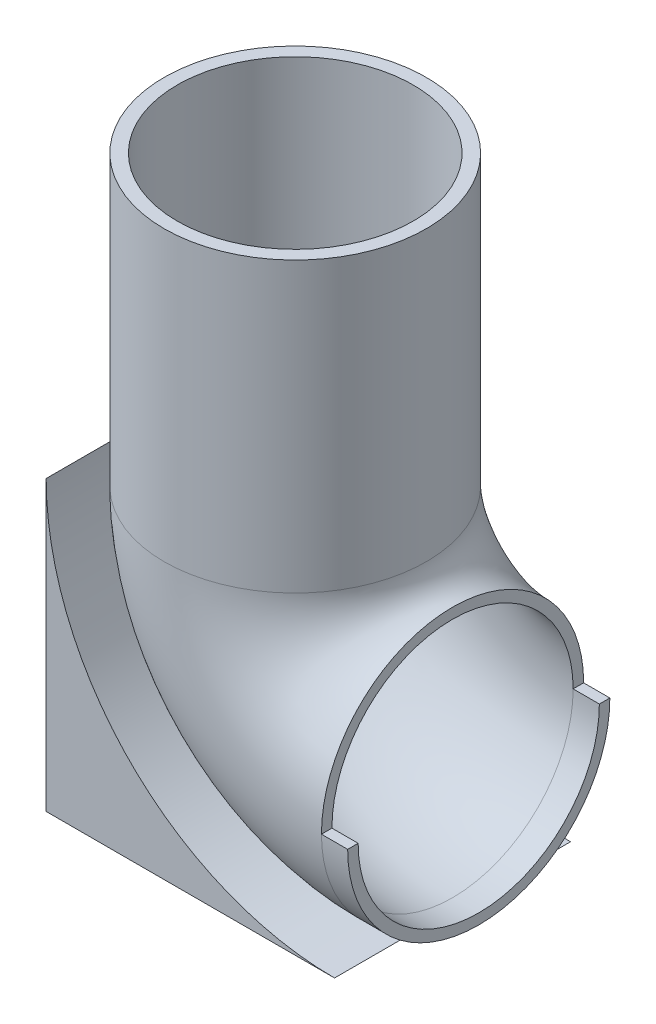
ISO-10303-21;
HEADER;
FILE_DESCRIPTION(('STEP AP214'),'2;1');
FILE_NAME('part.step','',(''),(''),'','','');
FILE_SCHEMA(('AUTOMOTIVE_DESIGN { 1 0 10303 214 1 1 1 1 }'));
ENDSEC;
DATA;
#1=APPLICATION_CONTEXT('core data for automotive mechanical design processes');
#2=APPLICATION_PROTOCOL_DEFINITION('international standard','automotive_design',2000,#1);
#3=PRODUCT_CONTEXT('',#1,'mechanical');
#4=PRODUCT('Part','Part','',(#3));
#5=PRODUCT_RELATED_PRODUCT_CATEGORY('part','',(#4));
#6=PRODUCT_DEFINITION_FORMATION('','',#4);
#7=PRODUCT_DEFINITION_CONTEXT('part definition',#1,'design');
#8=PRODUCT_DEFINITION('design','',#6,#7);
#9=PRODUCT_DEFINITION_SHAPE('','',#8);
#10=(LENGTH_UNIT() NAMED_UNIT(*) SI_UNIT(.MILLI.,.METRE.));
#11=(NAMED_UNIT(*) PLANE_ANGLE_UNIT() SI_UNIT($,.RADIAN.));
#12=(NAMED_UNIT(*) SI_UNIT($,.STERADIAN.) SOLID_ANGLE_UNIT());
#13=UNCERTAINTY_MEASURE_WITH_UNIT(LENGTH_MEASURE(1.E-05),#10,'distance_accuracy_value','');
#14=(GEOMETRIC_REPRESENTATION_CONTEXT(3) GLOBAL_UNCERTAINTY_ASSIGNED_CONTEXT((#13)) GLOBAL_UNIT_ASSIGNED_CONTEXT((#10,
#11,#12)) REPRESENTATION_CONTEXT('',''));
#15=CARTESIAN_POINT('',(0.,0.,0.));
#16=DIRECTION('',(0.,0.,1.));
#17=DIRECTION('',(1.,0.,0.));
#18=AXIS2_PLACEMENT_3D('',#15,#16,#17);
#19=CARTESIAN_POINT('',(0.,0.,22.5));
#20=DIRECTION('',(0.,0.,-1.));
#21=DIRECTION('',(-1.,0.,0.));
#22=AXIS2_PLACEMENT_3D('',#19,#20,#21);
#23=PLANE('',#22);
#24=CARTESIAN_POINT('',(30.0000000000001,0.,22.5));
#25=DIRECTION('',(0.,0.,-1.));
#26=DIRECTION('',(-1.,0.,0.));
#27=AXIS2_PLACEMENT_3D('',#24,#25,#26);
#28=CIRCLE('',#27,55.0000000000001);
#29=CARTESIAN_POINT('',(30.0000000000002,-55.,22.5));
#30=VERTEX_POINT('',#29);
#31=CARTESIAN_POINT('',(-25.,0.,22.5));
#32=VERTEX_POINT('',#31);
#33=EDGE_CURVE('E111',#30,#32,#28,.T.);
#34=ORIENTED_EDGE('',*,*,#33,.T.);
#35=DIRECTION('',(0.,-1.,0.));
#36=VECTOR('',#35,1.);
#37=CARTESIAN_POINT('',(-25.,0.,22.5));
#38=LINE('',#37,#36);
#39=CARTESIAN_POINT('',(-25.,-55.,22.5));
#40=VERTEX_POINT('',#39);
#41=EDGE_CURVE('E116',#32,#40,#38,.T.);
#42=ORIENTED_EDGE('',*,*,#41,.T.);
#43=DIRECTION('',(-1.,0.,0.));
#44=VECTOR('',#43,1.);
#45=CARTESIAN_POINT('',(30.0000000000002,-55.,22.5));
#46=LINE('',#45,#44);
#47=EDGE_CURVE('E91',#30,#40,#46,.T.);
#48=ORIENTED_EDGE('',*,*,#47,.F.);
#49=EDGE_LOOP('',(#34,#42,#48));
#50=FACE_BOUND('',#49,.T.);
#51=ADVANCED_FACE('F82',(#50),#23,.F.);
#52=CARTESIAN_POINT('',(0.,0.,-22.5));
#53=DIRECTION('',(0.,0.,-1.));
#54=DIRECTION('',(-1.,0.,0.));
#55=AXIS2_PLACEMENT_3D('',#52,#53,#54);
#56=PLANE('',#55);
#57=CARTESIAN_POINT('',(30.0000000000001,0.,-22.5));
#58=DIRECTION('',(0.,0.,-1.));
#59=DIRECTION('',(-1.,0.,0.));
#60=AXIS2_PLACEMENT_3D('',#57,#58,#59);
#61=CIRCLE('',#60,55.0000000000001);
#62=CARTESIAN_POINT('',(30.0000000000002,-55.,-22.5));
#63=VERTEX_POINT('',#62);
#64=CARTESIAN_POINT('',(-25.,0.,-22.5));
#65=VERTEX_POINT('',#64);
#66=EDGE_CURVE('E126',#63,#65,#61,.T.);
#67=ORIENTED_EDGE('',*,*,#66,.F.);
#68=DIRECTION('',(-1.,0.,0.));
#69=VECTOR('',#68,1.);
#70=CARTESIAN_POINT('',(30.0000000000002,-55.,-22.5));
#71=LINE('',#70,#69);
#72=CARTESIAN_POINT('',(-25.,-55.,-22.5));
#73=VERTEX_POINT('',#72);
#74=EDGE_CURVE('E13',#63,#73,#71,.T.);
#75=ORIENTED_EDGE('',*,*,#74,.T.);
#76=DIRECTION('',(0.,-1.,0.));
#77=VECTOR('',#76,1.);
#78=CARTESIAN_POINT('',(-25.,0.,-22.5));
#79=LINE('',#78,#77);
#80=EDGE_CURVE('E142',#65,#73,#79,.T.);
#81=ORIENTED_EDGE('',*,*,#80,.F.);
#82=EDGE_LOOP('',(#67,#75,#81));
#83=FACE_BOUND('',#82,.T.);
#84=ADVANCED_FACE('F158',(#83),#56,.T.);
#85=CARTESIAN_POINT('',(30.0000000000001,0.,-22.5));
#86=DIRECTION('',(0.,0.,1.));
#87=DIRECTION('',(1.,0.,0.));
#88=AXIS2_PLACEMENT_3D('',#85,#86,#87);
#89=CYLINDRICAL_SURFACE('',#88,55.0000000000001);
#90=ORIENTED_EDGE('',*,*,#33,.F.);
#91=DIRECTION('',(0.,0.,1.));
#92=VECTOR('',#91,1.);
#93=CARTESIAN_POINT('',(30.0000000000002,-55.,-22.5));
#94=LINE('',#93,#92);
#95=EDGE_CURVE('E122',#63,#30,#94,.T.);
#96=ORIENTED_EDGE('',*,*,#95,.F.);
#97=ORIENTED_EDGE('',*,*,#66,.T.);
#98=DIRECTION('',(0.,0.,1.));
#99=VECTOR('',#98,1.);
#100=CARTESIAN_POINT('',(-25.,0.,-22.5));
#101=LINE('',#100,#99);
#102=EDGE_CURVE('E130',#65,#32,#101,.T.);
#103=ORIENTED_EDGE('',*,*,#102,.T.);
#104=EDGE_LOOP('',(#90,#96,#97,#103));
#105=FACE_BOUND('',#104,.T.);
#106=ADVANCED_FACE('F128',(#105),#89,.F.);
#107=CARTESIAN_POINT('',(-25.,0.,-22.5));
#108=DIRECTION('',(-1.,0.,0.));
#109=DIRECTION('',(0.,0.,1.));
#110=AXIS2_PLACEMENT_3D('',#107,#108,#109);
#111=PLANE('',#110);
#112=ORIENTED_EDGE('',*,*,#41,.F.);
#113=ORIENTED_EDGE('',*,*,#102,.F.);
#114=ORIENTED_EDGE('',*,*,#80,.T.);
#115=DIRECTION('',(0.,0.,1.));
#116=VECTOR('',#115,1.);
#117=CARTESIAN_POINT('',(-25.,-55.,-22.5));
#118=LINE('',#117,#116);
#119=EDGE_CURVE('E119',#73,#40,#118,.T.);
#120=ORIENTED_EDGE('',*,*,#119,.T.);
#121=EDGE_LOOP('',(#112,#113,#114,#120));
#122=FACE_BOUND('',#121,.T.);
#123=ADVANCED_FACE('F157',(#122),#111,.T.);
#124=CARTESIAN_POINT('',(30.0000000000002,-55.,-22.5));
#125=DIRECTION('',(0.,1.,0.));
#126=DIRECTION('',(0.,0.,1.));
#127=AXIS2_PLACEMENT_3D('',#124,#125,#126);
#128=PLANE('',#127);
#129=CARTESIAN_POINT('',(-10.,-55.,15.));
#130=DIRECTION('',(0.,-1.,0.));
#131=DIRECTION('',(0.,0.,-1.));
#132=AXIS2_PLACEMENT_3D('',#129,#130,#131);
#133=CIRCLE('',#132,4.);
#134=CARTESIAN_POINT('',(-10.,-55.,11.));
#135=VERTEX_POINT('',#134);
#136=EDGE_CURVE('E134',#135,#135,#133,.T.);
#137=ORIENTED_EDGE('',*,*,#136,.F.);
#138=EDGE_LOOP('',(#137));
#139=FACE_BOUND('',#138,.T.);
#140=CARTESIAN_POINT('',(-10.,-55.,-15.));
#141=DIRECTION('',(0.,-1.,0.));
#142=DIRECTION('',(0.,0.,-1.));
#143=AXIS2_PLACEMENT_3D('',#140,#141,#142);
#144=CIRCLE('',#143,4.);
#145=CARTESIAN_POINT('',(-10.,-55.,-19.));
#146=VERTEX_POINT('',#145);
#147=EDGE_CURVE('E195',#146,#146,#144,.T.);
#148=ORIENTED_EDGE('',*,*,#147,.F.);
#149=EDGE_LOOP('',(#148));
#150=FACE_BOUND('',#149,.T.);
#151=ORIENTED_EDGE('',*,*,#47,.T.);
#152=ORIENTED_EDGE('',*,*,#119,.F.);
#153=ORIENTED_EDGE('',*,*,#74,.F.);
#154=ORIENTED_EDGE('',*,*,#95,.T.);
#155=EDGE_LOOP('',(#151,#152,#153,#154));
#156=FACE_BOUND('',#155,.T.);
#157=ADVANCED_FACE('F123',(#139,#150,#156),#128,.F.);
#158=CARTESIAN_POINT('',(-10.,-49.,-15.));
#159=DIRECTION('',(0.,-1.,0.));
#160=DIRECTION('',(0.,0.,-1.));
#161=AXIS2_PLACEMENT_3D('',#158,#159,#160);
#162=CYLINDRICAL_SURFACE('',#161,4.);
#163=CARTESIAN_POINT('',(-10.,-49.,-15.));
#164=DIRECTION('',(0.,-1.,0.));
#165=DIRECTION('',(0.,0.,-1.));
#166=AXIS2_PLACEMENT_3D('',#163,#164,#165);
#167=CIRCLE('',#166,4.);
#168=CARTESIAN_POINT('',(-10.,-49.,-19.));
#169=VERTEX_POINT('',#168);
#170=EDGE_CURVE('E198',#169,#169,#167,.T.);
#171=ORIENTED_EDGE('',*,*,#170,.F.);
#172=EDGE_LOOP('',(#171));
#173=FACE_BOUND('',#172,.T.);
#174=ORIENTED_EDGE('',*,*,#147,.T.);
#175=EDGE_LOOP('',(#174));
#176=FACE_BOUND('',#175,.T.);
#177=ADVANCED_FACE('F165',(#173,#176),#162,.F.);
#178=CARTESIAN_POINT('',(-10.,-49.,-15.));
#179=DIRECTION('',(0.,-1.,0.));
#180=DIRECTION('',(0.,0.,-1.));
#181=AXIS2_PLACEMENT_3D('',#178,#179,#180);
#182=PLANE('',#181);
#183=ORIENTED_EDGE('',*,*,#170,.T.);
#184=EDGE_LOOP('',(#183));
#185=FACE_BOUND('',#184,.T.);
#186=ADVANCED_FACE('F173',(#185),#182,.T.);
#187=CARTESIAN_POINT('',(-10.,-49.,15.));
#188=DIRECTION('',(0.,-1.,0.));
#189=DIRECTION('',(0.,0.,-1.));
#190=AXIS2_PLACEMENT_3D('',#187,#188,#189);
#191=CYLINDRICAL_SURFACE('',#190,4.);
#192=CARTESIAN_POINT('',(-10.,-49.,15.));
#193=DIRECTION('',(0.,-1.,0.));
#194=DIRECTION('',(0.,0.,-1.));
#195=AXIS2_PLACEMENT_3D('',#192,#193,#194);
#196=CIRCLE('',#195,4.);
#197=CARTESIAN_POINT('',(-10.,-49.,11.));
#198=VERTEX_POINT('',#197);
#199=EDGE_CURVE('E131',#198,#198,#196,.T.);
#200=ORIENTED_EDGE('',*,*,#199,.F.);
#201=EDGE_LOOP('',(#200));
#202=FACE_BOUND('',#201,.T.);
#203=ORIENTED_EDGE('',*,*,#136,.T.);
#204=EDGE_LOOP('',(#203));
#205=FACE_BOUND('',#204,.T.);
#206=ADVANCED_FACE('F181',(#202,#205),#191,.F.);
#207=CARTESIAN_POINT('',(-10.,-49.,15.));
#208=DIRECTION('',(0.,-1.,0.));
#209=DIRECTION('',(0.,0.,-1.));
#210=AXIS2_PLACEMENT_3D('',#207,#208,#209);
#211=PLANE('',#210);
#212=ORIENTED_EDGE('',*,*,#199,.T.);
#213=EDGE_LOOP('',(#212));
#214=FACE_BOUND('',#213,.T.);
#215=ADVANCED_FACE('F186',(#214),#211,.T.);
#216=CLOSED_SHELL('',(#51,#84,#106,#123,#157,#177,#186,#206,#215));
#217=MANIFOLD_SOLID_BREP('B2',#216);
#218=CARTESIAN_POINT('',(0.,55.,0.));
#219=DIRECTION('',(0.,1.,0.));
#220=DIRECTION('',(0.,0.,1.));
#221=AXIS2_PLACEMENT_3D('',#218,#219,#220);
#222=PLANE('',#221);
#223=CARTESIAN_POINT('',(0.,55.,0.));
#224=DIRECTION('',(0.,1.,0.));
#225=DIRECTION('',(0.,0.,1.));
#226=AXIS2_PLACEMENT_3D('',#223,#224,#225);
#227=CIRCLE('',#226,25.);
#228=CARTESIAN_POINT('',(0.,55.,25.));
#229=VERTEX_POINT('',#228);
#230=EDGE_CURVE('E345',#229,#229,#227,.T.);
#231=ORIENTED_EDGE('',*,*,#230,.T.);
#232=EDGE_LOOP('',(#231));
#233=FACE_BOUND('',#232,.T.);
#234=CARTESIAN_POINT('',(0.,55.,0.));
#235=DIRECTION('',(0.,1.,0.));
#236=DIRECTION('',(0.,0.,1.));
#237=AXIS2_PLACEMENT_3D('',#234,#235,#236);
#238=CIRCLE('',#237,22.5);
#239=CARTESIAN_POINT('',(0.,55.,22.5));
#240=VERTEX_POINT('',#239);
#241=EDGE_CURVE('E341',#240,#240,#238,.T.);
#242=ORIENTED_EDGE('',*,*,#241,.F.);
#243=EDGE_LOOP('',(#242));
#244=FACE_BOUND('',#243,.T.);
#245=ADVANCED_FACE('F258',(#233,#244),#222,.T.);
#246=CARTESIAN_POINT('',(0.,55.,0.));
#247=DIRECTION('',(0.,-1.,0.));
#248=DIRECTION('',(0.,0.,-1.));
#249=AXIS2_PLACEMENT_3D('',#246,#247,#248);
#250=CYLINDRICAL_SURFACE('',#249,25.);
#251=ORIENTED_EDGE('',*,*,#230,.F.);
#252=EDGE_LOOP('',(#251));
#253=FACE_BOUND('',#252,.T.);
#254=CARTESIAN_POINT('',(0.,0.,0.));
#255=DIRECTION('',(0.,1.,0.));
#256=DIRECTION('',(0.,0.,1.));
#257=AXIS2_PLACEMENT_3D('',#254,#255,#256);
#258=CIRCLE('',#257,25.);
#259=CARTESIAN_POINT('',(0.,0.,25.));
#260=VERTEX_POINT('',#259);
#261=EDGE_CURVE('E332',#260,#260,#258,.T.);
#262=ORIENTED_EDGE('',*,*,#261,.T.);
#263=EDGE_LOOP('',(#262));
#264=FACE_BOUND('',#263,.T.);
#265=ADVANCED_FACE('F260',(#253,#264),#250,.T.);
#266=CARTESIAN_POINT('',(0.,55.,0.));
#267=DIRECTION('',(0.,-1.,0.));
#268=DIRECTION('',(0.,0.,-1.));
#269=AXIS2_PLACEMENT_3D('',#266,#267,#268);
#270=CYLINDRICAL_SURFACE('',#269,22.5);
#271=ORIENTED_EDGE('',*,*,#241,.T.);
#272=EDGE_LOOP('',(#271));
#273=FACE_BOUND('',#272,.T.);
#274=CARTESIAN_POINT('',(0.,-2.,0.));
#275=DIRECTION('',(0.,1.,0.));
#276=DIRECTION('',(0.,0.,1.));
#277=AXIS2_PLACEMENT_3D('',#274,#275,#276);
#278=CIRCLE('',#277,22.5);
#279=CARTESIAN_POINT('',(0.,-2.,22.5));
#280=VERTEX_POINT('',#279);
#281=EDGE_CURVE('E362',#280,#280,#278,.T.);
#282=ORIENTED_EDGE('',*,*,#281,.F.);
#283=EDGE_LOOP('',(#282));
#284=FACE_BOUND('',#283,.T.);
#285=ADVANCED_FACE('F394',(#273,#284),#270,.F.);
#286=CARTESIAN_POINT('',(30.,0.,0.));
#287=DIRECTION('',(0.,0.,-1.));
#288=DIRECTION('',(-1.,0.,0.));
#289=AXIS2_PLACEMENT_3D('',#286,#287,#288);
#290=TOROIDAL_SURFACE('',#289,30.,25.);
#291=CARTESIAN_POINT('',(30.0000000000001,-30.,0.));
#292=DIRECTION('',(1.,0.,0.));
#293=DIRECTION('',(0.,1.,0.));
#294=AXIS2_PLACEMENT_3D('',#291,#292,#293);
#295=CIRCLE('',#294,25.);
#296=CARTESIAN_POINT('',(30.0000000000001,-30.,25.));
#297=VERTEX_POINT('',#296);
#298=CARTESIAN_POINT('',(30.0000000000001,-30.,-25.));
#299=VERTEX_POINT('',#298);
#300=EDGE_CURVE('E320',#297,#299,#295,.T.);
#301=ORIENTED_EDGE('',*,*,#300,.F.);
#302=CARTESIAN_POINT('',(30.0000000000001,-30.,0.));
#303=DIRECTION('',(-1.,0.,0.));
#304=DIRECTION('',(0.,-1.,0.));
#305=AXIS2_PLACEMENT_3D('',#302,#303,#304);
#306=CIRCLE('',#305,25.);
#307=EDGE_CURVE('E296',#297,#299,#306,.T.);
#308=ORIENTED_EDGE('',*,*,#307,.T.);
#309=EDGE_LOOP('',(#301,#308));
#310=FACE_BOUND('',#309,.T.);
#311=ORIENTED_EDGE('',*,*,#261,.F.);
#312=EDGE_LOOP('',(#311));
#313=FACE_BOUND('',#312,.T.);
#314=ADVANCED_FACE('F325',(#310,#313),#290,.T.);
#315=CARTESIAN_POINT('',(35.0000000000001,-30.,0.));
#316=DIRECTION('',(-1.,0.,0.));
#317=DIRECTION('',(0.,-1.,0.));
#318=AXIS2_PLACEMENT_3D('',#315,#316,#317);
#319=CYLINDRICAL_SURFACE('',#318,25.);
#320=CARTESIAN_POINT('',(35.0000000000001,-30.,0.));
#321=DIRECTION('',(1.,0.,0.));
#322=DIRECTION('',(0.,1.,0.));
#323=AXIS2_PLACEMENT_3D('',#320,#321,#322);
#324=CIRCLE('',#323,25.);
#325=CARTESIAN_POINT('',(35.0000000000001,-30.,25.));
#326=VERTEX_POINT('',#325);
#327=CARTESIAN_POINT('',(35.0000000000001,-30.,-25.));
#328=VERTEX_POINT('',#327);
#329=EDGE_CURVE('E322',#326,#328,#324,.T.);
#330=ORIENTED_EDGE('',*,*,#329,.F.);
#331=DIRECTION('',(1.,0.,0.));
#332=VECTOR('',#331,1.);
#333=CARTESIAN_POINT('',(30.0000000000001,-30.,25.));
#334=LINE('',#333,#332);
#335=EDGE_CURVE('E310',#297,#326,#334,.T.);
#336=ORIENTED_EDGE('',*,*,#335,.F.);
#337=ORIENTED_EDGE('',*,*,#300,.T.);
#338=DIRECTION('',(1.,0.,0.));
#339=VECTOR('',#338,1.);
#340=CARTESIAN_POINT('',(30.0000000000001,-30.,-25.));
#341=LINE('',#340,#339);
#342=EDGE_CURVE('E305',#299,#328,#341,.T.);
#343=ORIENTED_EDGE('',*,*,#342,.T.);
#344=EDGE_LOOP('',(#330,#336,#337,#343));
#345=FACE_BOUND('',#344,.T.);
#346=ADVANCED_FACE('F318',(#345),#319,.T.);
#347=CARTESIAN_POINT('',(35.0000000000001,-30.,0.));
#348=DIRECTION('',(1.,0.,0.));
#349=DIRECTION('',(0.,1.,0.));
#350=AXIS2_PLACEMENT_3D('',#347,#348,#349);
#351=PLANE('',#350);
#352=DIRECTION('',(0.,0.,-1.));
#353=VECTOR('',#352,1.);
#354=CARTESIAN_POINT('',(35.0000000000001,-30.,25.));
#355=LINE('',#354,#353);
#356=CARTESIAN_POINT('',(35.0000000000001,-30.,23.));
#357=VERTEX_POINT('',#356);
#358=EDGE_CURVE('E361',#326,#357,#355,.T.);
#359=ORIENTED_EDGE('',*,*,#358,.F.);
#360=ORIENTED_EDGE('',*,*,#329,.T.);
#361=CARTESIAN_POINT('',(35.0000000000001,-30.,-23.));
#362=VERTEX_POINT('',#361);
#363=EDGE_CURVE('E353',#362,#328,#355,.T.);
#364=ORIENTED_EDGE('',*,*,#363,.F.);
#365=CARTESIAN_POINT('',(35.0000000000001,-30.,0.));
#366=DIRECTION('',(1.,0.,0.));
#367=DIRECTION('',(0.,1.,0.));
#368=AXIS2_PLACEMENT_3D('',#365,#366,#367);
#369=CIRCLE('',#368,23.);
#370=EDGE_CURVE('E335',#357,#362,#369,.T.);
#371=ORIENTED_EDGE('',*,*,#370,.F.);
#372=EDGE_LOOP('',(#359,#360,#364,#371));
#373=FACE_BOUND('',#372,.T.);
#374=ADVANCED_FACE('F359',(#373),#351,.T.);
#375=CARTESIAN_POINT('',(30.,0.,0.));
#376=DIRECTION('',(0.,0.,-1.));
#377=DIRECTION('',(-1.,0.,0.));
#378=AXIS2_PLACEMENT_3D('',#375,#376,#377);
#379=TOROIDAL_SURFACE('',#378,30.,23.);
#380=CARTESIAN_POINT('',(30.0000000000001,-30.,0.));
#381=DIRECTION('',(-1.,0.,0.));
#382=DIRECTION('',(0.,-1.,0.));
#383=AXIS2_PLACEMENT_3D('',#380,#381,#382);
#384=CIRCLE('',#383,23.);
#385=CARTESIAN_POINT('',(30.0000000000001,-30.,-23.));
#386=VERTEX_POINT('',#385);
#387=CARTESIAN_POINT('',(30.0000000000001,-30.,23.));
#388=VERTEX_POINT('',#387);
#389=EDGE_CURVE('E278',#386,#388,#384,.F.);
#390=ORIENTED_EDGE('',*,*,#389,.T.);
#391=EDGE_CURVE('E304',#388,#386,#384,.F.);
#392=ORIENTED_EDGE('',*,*,#391,.T.);
#393=EDGE_LOOP('',(#390,#392));
#394=FACE_BOUND('',#393,.T.);
#395=CARTESIAN_POINT('',(-16.1521800609827,-2.,-16.3311344858411));
#396=CARTESIAN_POINT('',(-15.6926575254816,-2.,-16.7864193980092));
#397=CARTESIAN_POINT('',(-15.213968669036,-2.,-17.2222546662401));
#398=CARTESIAN_POINT('',(-14.2214193138179,-2.,-18.0521918617121));
#399=CARTESIAN_POINT('',(-13.7075494564307,-2.,-18.4462826127835));
#400=CARTESIAN_POINT('',(-12.6478514648188,-2.,-19.1901855512612));
#401=CARTESIAN_POINT('',(-12.1019881106165,-2.,-19.5399475477929));
#402=CARTESIAN_POINT('',(-10.9827539200928,-2.,-20.1921863736468));
#403=CARTESIAN_POINT('',(-10.4093849401818,-2.,-20.4946663882742));
#404=CARTESIAN_POINT('',(-9.23949888869036,-2.,-21.0500886829596));
#405=CARTESIAN_POINT('',(-8.64299388201044,-2.,-21.3030563772269));
#406=CARTESIAN_POINT('',(-7.43079481547017,-2.,-21.7578764219807));
#407=CARTESIAN_POINT('',(-6.81510045381304,-2.,-21.959727968092));
#408=CARTESIAN_POINT('',(-5.56907365480272,-2.,-22.310856956331));
#409=CARTESIAN_POINT('',(-4.93874509498806,-2.,-22.4601481593653));
#410=CARTESIAN_POINT('',(-3.6677703630087,-2.,-22.7052020603749));
#411=CARTESIAN_POINT('',(-3.02712422184022,-2.,-22.80096491913));
#412=CARTESIAN_POINT('',(-1.73923523342294,-2.,-22.9384078396291));
#413=CARTESIAN_POINT('',(-1.09198505176568,-2.,-22.9800191722588));
#414=CARTESIAN_POINT('',(0.203721546881954,-2.,-23.0086816011404));
#415=CARTESIAN_POINT('',(0.852177965436526,-2.,-22.9957326265915));
#416=CARTESIAN_POINT('',(2.14574403765465,-2.,-22.9154127847956));
#417=CARTESIAN_POINT('',(2.79085351614781,-2.,-22.8480390974455));
#418=CARTESIAN_POINT('',(4.07314309619693,-2.,-22.6593984639075));
#419=CARTESIAN_POINT('',(4.71032318272901,-2.,-22.5381314156235));
#420=CARTESIAN_POINT('',(5.9740743629958,-2.,-22.2422012808867));
#421=CARTESIAN_POINT('',(6.6006100921216,-2.,-22.0673871728954));
#422=CARTESIAN_POINT('',(7.83679631730266,-2.,-21.6657898134567));
#423=CARTESIAN_POINT('',(8.44644679249724,-2.,-21.4390064978077));
#424=CARTESIAN_POINT('',(9.64458488843265,-2.,-20.9351534558422));
#425=CARTESIAN_POINT('',(10.2330729166768,-2.,-20.6580846984422));
#426=CARTESIAN_POINT('',(11.3848067532069,-2.,-20.0556891263433));
#427=CARTESIAN_POINT('',(11.9480524710712,-2.,-19.7303621387943));
#428=CARTESIAN_POINT('',(13.0481935102415,-2.,-19.0320471424553));
#429=CARTESIAN_POINT('',(13.5849408057043,-2.,-18.6588259223683));
#430=CARTESIAN_POINT('',(14.6252851588449,-2.,-17.8687383319873));
#431=CARTESIAN_POINT('',(15.1288821020005,-2.,-17.4518718109278));
#432=CARTESIAN_POINT('',(16.0995165014533,-2.,-16.577434194432));
#433=CARTESIAN_POINT('',(16.5665495667199,-2.,-16.1198582241686));
#434=CARTESIAN_POINT('',(17.4607594053644,-2.,-15.1673202270641));
#435=CARTESIAN_POINT('',(17.8879359468592,-2.,-14.6723579827418));
#436=CARTESIAN_POINT('',(18.7023863145778,-2.,-13.6448096288823));
#437=CARTESIAN_POINT('',(19.0893573882524,-2.,-13.1119827340714));
#438=CARTESIAN_POINT('',(19.6350393901427,-2.,-12.2899102491123));
#439=CARTESIAN_POINT('',(19.8111453749308,-2.,-12.012066601675));
#440=CARTESIAN_POINT('',(20.1515277307385,-2.,-11.4491204648222));
#441=CARTESIAN_POINT('',(20.3158008923244,-2.,-11.1640160342242));
#442=CARTESIAN_POINT('',(20.7902696333907,-2.,-10.2987141520804));
#443=CARTESIAN_POINT('',(21.0822125995843,-2.,-9.70838029140693));
#444=CARTESIAN_POINT('',(21.6147716228901,-2.,-8.50499702131085));
#445=CARTESIAN_POINT('',(21.855389172049,-2.,-7.89194827282576));
#446=CARTESIAN_POINT('',(22.175655118788,-2.,-6.95983997765273));
#447=CARTESIAN_POINT('',(22.2754950941204,-2.,-6.64760221958503));
#448=CARTESIAN_POINT('',(22.4615752123163,-2.,-6.01918966454013));
#449=CARTESIAN_POINT('',(22.547818830936,-2.,-5.70301589613211));
#450=CARTESIAN_POINT('',(22.7858033981648,-2.,-4.74925681688985));
#451=CARTESIAN_POINT('',(22.916822930735,-2.,-4.10636145040781));
#452=CARTESIAN_POINT('',(23.1216581394896,-2.,-2.8119308154001));
#453=CARTESIAN_POINT('',(23.1955031162419,-2.,-2.16040014661843));
#454=CARTESIAN_POINT('',(23.2849916995733,-2.,-0.85334090478862));
#455=CARTESIAN_POINT('',(23.3006378093596,-2.,-0.197812504902748));
#456=CARTESIAN_POINT('',(23.274021388634,-2.,1.08562440319145));
#457=CARTESIAN_POINT('',(23.2340655218374,-2.,1.71358208706634));
#458=CARTESIAN_POINT('',(23.1009202111351,-2.,2.96379224834695));
#459=CARTESIAN_POINT('',(23.0077316249073,-2.,3.58604481750854));
#460=CARTESIAN_POINT('',(22.7693144117282,-2.,4.82075351444813));
#461=CARTESIAN_POINT('',(22.6240700341903,-2.,5.43320661853546));
#462=CARTESIAN_POINT('',(22.3685302313426,-2.,6.34107544319904));
#463=CARTESIAN_POINT('',(22.277065058318,-2.,6.64191362944558));
#464=CARTESIAN_POINT('',(22.0817807642377,-2.,7.23963374172556));
#465=CARTESIAN_POINT('',(21.9779587431334,-2.,7.53651472078432));
#466=CARTESIAN_POINT('',(21.6480078898674,-2.,8.42129893184051));
#467=CARTESIAN_POINT('',(21.4036322582824,-2.,9.0024997017709));
#468=CARTESIAN_POINT('',(20.8684120551748,-2.,10.1430955757506));
#469=CARTESIAN_POINT('',(20.5775664262623,-2.,10.7024901832566));
#470=CARTESIAN_POINT('',(20.1081575323736,-2.,11.5225008886526));
#471=CARTESIAN_POINT('',(19.9461359663171,-2.,11.7926992207045));
#472=CARTESIAN_POINT('',(19.6113581918716,-2.,12.3262670918269));
#473=CARTESIAN_POINT('',(19.438604657412,-2.,12.5896383089174));
#474=CARTESIAN_POINT('',(18.90457898242,-2.,13.3690313712884));
#475=CARTESIAN_POINT('',(18.5275243416873,-2.,13.8743630573373));
#476=CARTESIAN_POINT('',(17.7182637156236,-2.,14.8723732273397));
#477=CARTESIAN_POINT('',(17.2844645497111,-2.,15.3637572254849));
#478=CARTESIAN_POINT('',(16.3772222154077,-2.,16.308499853078));
#479=CARTESIAN_POINT('',(15.9037780475323,-2.,16.7618575232725));
#480=CARTESIAN_POINT('',(14.9205181931885,-2.,17.6272929111927));
#481=CARTESIAN_POINT('',(14.410700864263,-2.,18.0393687627847));
#482=CARTESIAN_POINT('',(13.3582493665743,-2.,18.8192331657889));
#483=CARTESIAN_POINT('',(12.8156153525256,-2.,19.1870219259683));
#484=CARTESIAN_POINT('',(11.6987946249169,-2.,19.8771759093526));
#485=CARTESIAN_POINT('',(11.1244765231026,-2.,20.1993285669752));
#486=CARTESIAN_POINT('',(9.95060924206719,-2.,20.7938276774854));
#487=CARTESIAN_POINT('',(9.35105990885838,-2.,21.0661738263468));
#488=CARTESIAN_POINT('',(8.13101425408906,-2.,21.5590071777136));
#489=CARTESIAN_POINT('',(7.51051804810055,-2.,21.7794946662897));
#490=CARTESIAN_POINT('',(6.25303253341804,-2.,22.1669364885114));
#491=CARTESIAN_POINT('',(5.61604333503424,-2.,22.3338911801007));
#492=CARTESIAN_POINT('',(4.33460010227464,-2.,22.6120235341551));
#493=CARTESIAN_POINT('',(3.69022774050706,-2.,22.7235775768776));
#494=CARTESIAN_POINT('',(2.39435413164893,-2.,22.8917608139302));
#495=CARTESIAN_POINT('',(1.74285291167736,-2.,22.9483902171262));
#496=CARTESIAN_POINT('',(0.4374122221025,-2.,23.0062608346488));
#497=CARTESIAN_POINT('',(-0.216527179834112,-2.,23.0075035748415));
#498=CARTESIAN_POINT('',(-1.52215773494206,-2.,22.9545470669805));
#499=CARTESIAN_POINT('',(-2.17384889436919,-2.,22.9003479733204));
#500=CARTESIAN_POINT('',(-3.46692359629845,-2.,22.7372812533409));
#501=CARTESIAN_POINT('',(-4.10834304497831,-2.,22.6286982512655));
#502=CARTESIAN_POINT('',(-5.37971986504905,-2.,22.3577503644255));
#503=CARTESIAN_POINT('',(-6.00967727697051,-2.,22.1953856698757));
#504=CARTESIAN_POINT('',(-7.25361210238697,-2.,21.8180080771643));
#505=CARTESIAN_POINT('',(-7.86758971152939,-2.,21.6029958239247));
#506=CARTESIAN_POINT('',(-9.07517065444511,-2.,21.1218360648219));
#507=CARTESIAN_POINT('',(-9.66877401256356,-2.,20.8556886200627));
#508=CARTESIAN_POINT('',(-10.829654366344,-2.,20.2749907292944));
#509=CARTESIAN_POINT('',(-11.3970028744203,-2.,19.9605832355885));
#510=CARTESIAN_POINT('',(-12.50315510718,-2.,19.2850295821032));
#511=CARTESIAN_POINT('',(-13.0419588910842,-2.,18.9238835192962));
#512=CARTESIAN_POINT('',(-14.0871680276657,-2.,18.1574163861177));
#513=CARTESIAN_POINT('',(-14.5935735623875,-2.,17.7520955639971));
#514=CARTESIAN_POINT('',(-15.5703677404151,-2.,16.9001580905109));
#515=CARTESIAN_POINT('',(-16.040756405545,-2.,16.4535414641685));
#516=CARTESIAN_POINT('',(-16.9414398208475,-2.,15.5229267266313));
#517=CARTESIAN_POINT('',(-17.3717966113448,-2.,15.0389886587023));
#518=CARTESIAN_POINT('',(-18.1901804079075,-2.,14.0365548552536));
#519=CARTESIAN_POINT('',(-18.5782074620006,-2.,13.5180591589441));
#520=CARTESIAN_POINT('',(-19.3091615164887,-2.,12.4501978292283));
#521=CARTESIAN_POINT('',(-19.6520885918447,-2.,11.9008322471333));
#522=CARTESIAN_POINT('',(-20.2903948142374,-2.,10.7751396299389));
#523=CARTESIAN_POINT('',(-20.5857739770919,-2.,10.1988126038089));
#524=CARTESIAN_POINT('',(-21.1266523269663,-2.,9.02378400590773));
#525=CARTESIAN_POINT('',(-21.3721923011671,-2.,8.42510120854565));
#526=CARTESIAN_POINT('',(-21.8119453210343,-2.,7.20917270180321));
#527=CARTESIAN_POINT('',(-22.0061583882924,-2.,6.59192700023179));
#528=CARTESIAN_POINT('',(-22.3418654386283,-2.,5.34328929414631));
#529=CARTESIAN_POINT('',(-22.4833616007508,-2.,4.71189787548709));
#530=CARTESIAN_POINT('',(-22.7126367849094,-2.,3.43943674473733));
#531=CARTESIAN_POINT('',(-22.800415868668,-2.,2.79836704376829));
#532=CARTESIAN_POINT('',(-22.9216002073231,-2.,1.51143757080273));
#533=CARTESIAN_POINT('',(-22.955033053605,-2.,0.865580396810736));
#534=CARTESIAN_POINT('',(-22.9673727585874,-2.,-0.426657004303744));
#535=CARTESIAN_POINT('',(-22.946279419517,-2.,-1.0730372333149));
#536=CARTESIAN_POINT('',(-22.8497041834717,-2.,-2.36188835981571));
#537=CARTESIAN_POINT('',(-22.7742083636222,-2.,-3.00435821409404));
#538=CARTESIAN_POINT('',(-22.56935276602,-2.,-4.28064150050898));
#539=CARTESIAN_POINT('',(-22.4399938450597,-2.,-4.91445507017423));
#540=CARTESIAN_POINT('',(-22.1282764603488,-2.,-6.16916037068424));
#541=CARTESIAN_POINT('',(-21.9458985591163,-2.,-6.79004727281584));
#542=CARTESIAN_POINT('',(-21.5294508477414,-2.,-8.01427988395138));
#543=CARTESIAN_POINT('',(-21.2953775817586,-2.,-8.61762441719326));
#544=CARTESIAN_POINT('',(-20.7774967690291,-2.,-9.80178604301557));
#545=CARTESIAN_POINT('',(-20.4937449810371,-2.,-10.382627509511));
#546=CARTESIAN_POINT('',(-19.8784623744136,-2.,-11.5181825073866));
#547=CARTESIAN_POINT('',(-19.546944243503,-2.,-12.0729029253016));
#548=CARTESIAN_POINT('',(-18.7526122293567,-2.,-13.2831671053083));
#549=CARTESIAN_POINT('',(-18.2774360456031,-2.,-13.9306450908125));
#550=CARTESIAN_POINT('',(-17.2620516555368,-2.,-15.1724237457622));
#551=CARTESIAN_POINT('',(-16.7218434504741,-2.,-15.76672441623));
#552=CARTESIAN_POINT('',(-16.1521800609827,-2.,-16.3311344858411));
#553=B_SPLINE_CURVE_WITH_KNOTS('',3,(#395,#396,#397,#398,#399,#400,#401,#402,#403,#404,#405,
#406,#407,#408,#409,#410,#411,#412,#413,#414,#415,#416,#417,#418,#419,#420,#421,#422,#423,#424,
#425,#426,#427,#428,#429,#430,#431,#432,#433,#434,#435,#436,#437,#438,#439,#440,#441,#442,#443,
#444,#445,#446,#447,#448,#449,#450,#451,#452,#453,#454,#455,#456,#457,#458,#459,#460,#461,#462,
#463,#464,#465,#466,#467,#468,#469,#470,#471,#472,#473,#474,#475,#476,#477,#478,#479,#480,#481,
#482,#483,#484,#485,#486,#487,#488,#489,#490,#491,#492,#493,#494,#495,#496,#497,#498,#499,#500,
#501,#502,#503,#504,#505,#506,#507,#508,#509,#510,#511,#512,#513,#514,#515,#516,#517,#518,#519,
#520,#521,#522,#523,#524,#525,#526,#527,#528,#529,#530,#531,#532,#533,#534,#535,#536,#537,#538,
#539,#540,#541,#542,#543,#544,#545,#546,#547,#548,#549,#550,#551,#552),.UNSPECIFIED.,.T.,.F.,(4,
2,2,2,2,2,2,2,2,2,2,2,2,2,2,2,2,2,2,2,2,2,2,2,2,2,2,2,2,2,2,2,2,2,2,2,2,2,2,2,2,2,2,2,2,2,2,2,2,
2,2,2,2,2,2,2,2,2,2,2,2,2,2,2,2,2,2,2,2,2,2,2,2,2,2,2,2,2,4),(0.,1.93991839425366,
3.88035485291781,5.82296909189847,7.76545240386777,9.70693602743569,11.6484502007265,
13.5894556844593,15.5304553380846,17.473916113453,19.4173794107803,21.3609434182151,
23.3045111075702,25.2536116155399,27.2027145313943,29.151779895276,31.1008522404421,
33.0598034131403,35.0187613529353,36.9779541882633,38.9371584213613,40.9101838602588,
41.8967929639434,42.8836686671805,44.8568895332225,46.8300530292678,47.8132187803079,
48.7961327870658,50.7617322537763,52.7263237306426,54.6908307069543,56.5762250577013,
58.4615890321014,60.34752394572,61.2906002624067,62.2338983492613,64.1231163498011,
66.0123773442021,66.9573097385098,67.9020076346711,69.7912985354554,71.7554404296768,
73.7196318565116,75.6839120340697,77.6481829517354,79.6213217811544,81.5944726545013,
83.5676126429897,85.5407394379203,87.5002713074419,89.4597957252785,91.4192661594776,
93.3787311369925,95.3280465488011,97.2773550663529,99.2266397064659,101.175922017302,
103.119537933836,105.063149817854,107.006750779832,108.950350564094,110.890886195384,
112.831419624908,114.771949829014,116.712479387556,118.651414403453,120.5903486037,
122.529202649526,124.468054467548,126.405921629823,128.343795820908,130.2821661358,
132.220505618498,134.159556621009,136.098737288534,138.03575522841,139.972259601852,
142.377148206164,144.782036764246),.UNSPECIFIED.);
#554=CARTESIAN_POINT('',(-16.1521800609827,-2.,-16.3311344858411));
#555=VERTEX_POINT('',#554);
#556=EDGE_CURVE('E328',#555,#555,#553,.T.);
#557=ORIENTED_EDGE('',*,*,#556,.F.);
#558=EDGE_LOOP('',(#557));
#559=FACE_BOUND('',#558,.T.);
#560=ADVANCED_FACE('F374',(#394,#559),#379,.F.);
#561=CARTESIAN_POINT('',(0.,-2.,0.));
#562=DIRECTION('',(0.,1.,0.));
#563=DIRECTION('',(0.,0.,1.));
#564=AXIS2_PLACEMENT_3D('',#561,#562,#563);
#565=PLANE('',#564);
#566=ORIENTED_EDGE('',*,*,#281,.T.);
#567=EDGE_LOOP('',(#566));
#568=FACE_BOUND('',#567,.T.);
#569=ORIENTED_EDGE('',*,*,#556,.T.);
#570=EDGE_LOOP('',(#569));
#571=FACE_BOUND('',#570,.T.);
#572=ADVANCED_FACE('F377',(#568,#571),#565,.F.);
#573=CARTESIAN_POINT('',(35.0000000000001,-30.,0.));
#574=DIRECTION('',(-1.,0.,0.));
#575=DIRECTION('',(0.,-1.,0.));
#576=AXIS2_PLACEMENT_3D('',#573,#574,#575);
#577=CYLINDRICAL_SURFACE('',#576,23.);
#578=DIRECTION('',(-1.,0.,0.));
#579=VECTOR('',#578,1.);
#580=CARTESIAN_POINT('',(35.0000000000001,-30.,23.));
#581=LINE('',#580,#579);
#582=EDGE_CURVE('E80',#357,#388,#581,.T.);
#583=ORIENTED_EDGE('',*,*,#582,.F.);
#584=ORIENTED_EDGE('',*,*,#370,.T.);
#585=DIRECTION('',(-1.,0.,0.));
#586=VECTOR('',#585,1.);
#587=CARTESIAN_POINT('',(35.0000000000001,-30.,-23.));
#588=LINE('',#587,#586);
#589=EDGE_CURVE('E267',#386,#362,#588,.F.);
#590=ORIENTED_EDGE('',*,*,#589,.F.);
#591=ORIENTED_EDGE('',*,*,#391,.F.);
#592=EDGE_LOOP('',(#583,#584,#590,#591));
#593=FACE_BOUND('',#592,.T.);
#594=ADVANCED_FACE('F364',(#593),#577,.F.);
#595=CARTESIAN_POINT('',(30.0000000000001,-30.,25.));
#596=DIRECTION('',(0.,-1.,0.));
#597=DIRECTION('',(1.,0.,0.));
#598=AXIS2_PLACEMENT_3D('',#595,#596,#597);
#599=PLANE('',#598);
#600=ORIENTED_EDGE('',*,*,#582,.T.);
#601=DIRECTION('',(0.,0.,-1.));
#602=VECTOR('',#601,1.);
#603=CARTESIAN_POINT('',(30.0000000000001,-30.,25.));
#604=LINE('',#603,#602);
#605=EDGE_CURVE('E274',#297,#388,#604,.T.);
#606=ORIENTED_EDGE('',*,*,#605,.F.);
#607=ORIENTED_EDGE('',*,*,#335,.T.);
#608=ORIENTED_EDGE('',*,*,#358,.T.);
#609=EDGE_LOOP('',(#600,#606,#607,#608));
#610=FACE_BOUND('',#609,.T.);
#611=ADVANCED_FACE('F309',(#610),#599,.F.);
#612=CARTESIAN_POINT('',(30.0000000000001,-24.6114857463779,0.));
#613=DIRECTION('',(-1.,0.,0.));
#614=DIRECTION('',(0.,-1.,0.));
#615=AXIS2_PLACEMENT_3D('',#612,#613,#614);
#616=PLANE('',#615);
#617=ORIENTED_EDGE('',*,*,#605,.T.);
#618=ORIENTED_EDGE('',*,*,#389,.F.);
#619=EDGE_CURVE('E298',#386,#299,#604,.T.);
#620=ORIENTED_EDGE('',*,*,#619,.T.);
#621=ORIENTED_EDGE('',*,*,#307,.F.);
#622=EDGE_LOOP('',(#617,#618,#620,#621));
#623=FACE_BOUND('',#622,.T.);
#624=ADVANCED_FACE('F297',(#623),#616,.F.);
#625=ORIENTED_EDGE('',*,*,#589,.T.);
#626=ORIENTED_EDGE('',*,*,#363,.T.);
#627=ORIENTED_EDGE('',*,*,#342,.F.);
#628=ORIENTED_EDGE('',*,*,#619,.F.);
#629=EDGE_LOOP('',(#625,#626,#627,#628));
#630=FACE_BOUND('',#629,.T.);
#631=ADVANCED_FACE('F352',(#630),#599,.F.);
#632=CLOSED_SHELL('',(#245,#265,#285,#314,#346,#374,#560,#572,#594,#611,#624,#631));
#633=MANIFOLD_SOLID_BREP('B7',#632);
#634=ADVANCED_BREP_SHAPE_REPRESENTATION('',(#18,#217,#633),#14);
#635=SHAPE_DEFINITION_REPRESENTATION(#9,#634);
ENDSEC;
END-ISO-10303-21;
